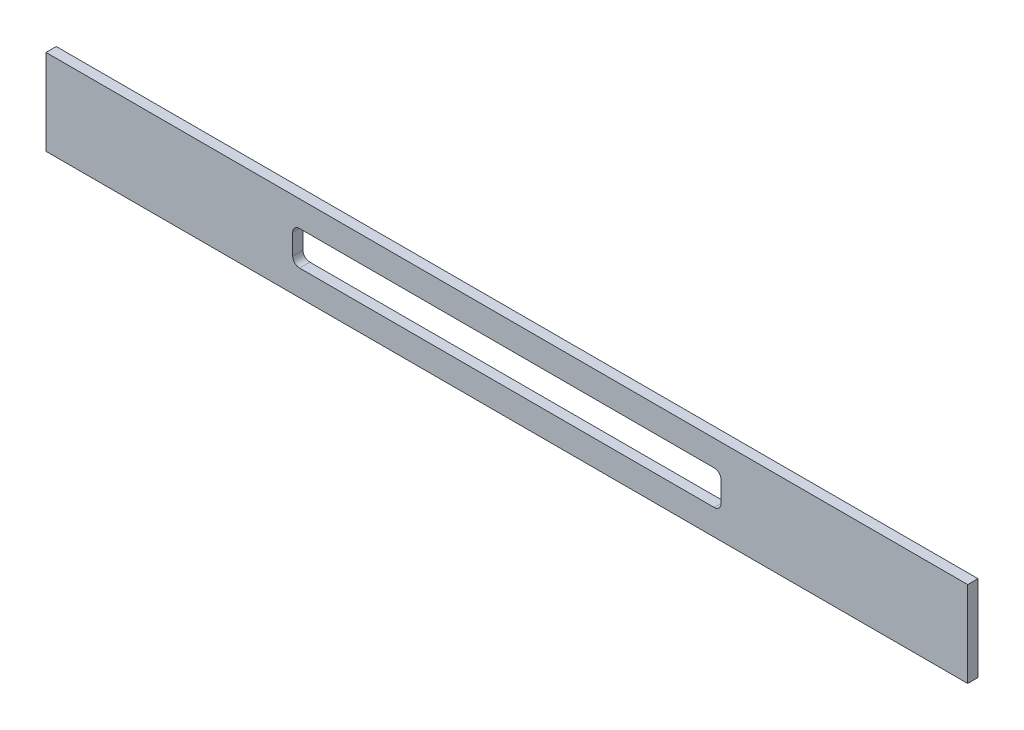
ISO-10303-21;
HEADER;
FILE_DESCRIPTION(('STEP AP214'),'2;1');
FILE_NAME('part.step','',(''),(''),'','','');
FILE_SCHEMA(('AUTOMOTIVE_DESIGN { 1 0 10303 214 1 1 1 1 }'));
ENDSEC;
DATA;
#1=APPLICATION_CONTEXT('core data for automotive mechanical design processes');
#2=APPLICATION_PROTOCOL_DEFINITION('international standard','automotive_design',2000,#1);
#3=PRODUCT_CONTEXT('',#1,'mechanical');
#4=PRODUCT('Part','Part','',(#3));
#5=PRODUCT_RELATED_PRODUCT_CATEGORY('part','',(#4));
#6=PRODUCT_DEFINITION_FORMATION('','',#4);
#7=PRODUCT_DEFINITION_CONTEXT('part definition',#1,'design');
#8=PRODUCT_DEFINITION('design','',#6,#7);
#9=PRODUCT_DEFINITION_SHAPE('','',#8);
#10=(LENGTH_UNIT() NAMED_UNIT(*) SI_UNIT(.MILLI.,.METRE.));
#11=(NAMED_UNIT(*) PLANE_ANGLE_UNIT() SI_UNIT($,.RADIAN.));
#12=(NAMED_UNIT(*) SI_UNIT($,.STERADIAN.) SOLID_ANGLE_UNIT());
#13=UNCERTAINTY_MEASURE_WITH_UNIT(LENGTH_MEASURE(1.E-05),#10,'distance_accuracy_value','');
#14=(GEOMETRIC_REPRESENTATION_CONTEXT(3) GLOBAL_UNCERTAINTY_ASSIGNED_CONTEXT((#13)) GLOBAL_UNIT_ASSIGNED_CONTEXT((#10,
#11,#12)) REPRESENTATION_CONTEXT('',''));
#15=CARTESIAN_POINT('',(0.,0.,0.));
#16=DIRECTION('',(0.,0.,1.));
#17=DIRECTION('',(1.,0.,0.));
#18=AXIS2_PLACEMENT_3D('',#15,#16,#17);
#19=CARTESIAN_POINT('',(0.,0.,6.));
#20=DIRECTION('',(0.,0.,1.));
#21=DIRECTION('',(1.,0.,0.));
#22=AXIS2_PLACEMENT_3D('',#19,#20,#21);
#23=PLANE('',#22);
#24=DIRECTION('',(0.,-1.,0.));
#25=VECTOR('',#24,1.);
#26=CARTESIAN_POINT('',(-173.830324909747,7.20083418302885,6.));
#27=LINE('',#26,#25);
#28=CARTESIAN_POINT('',(-173.830324909747,7.20083418302885,6.));
#29=VERTEX_POINT('',#28);
#30=CARTESIAN_POINT('',(-173.830324909747,-42.7991658169712,6.));
#31=VERTEX_POINT('',#30);
#32=EDGE_CURVE('E218',#29,#31,#27,.T.);
#33=ORIENTED_EDGE('',*,*,#32,.T.);
#34=DIRECTION('',(1.,0.,0.));
#35=VECTOR('',#34,1.);
#36=CARTESIAN_POINT('',(-173.830324909747,-42.7991658169712,6.));
#37=LINE('',#36,#35);
#38=CARTESIAN_POINT('',(364.169675090253,-42.7991658169712,6.));
#39=VERTEX_POINT('',#38);
#40=EDGE_CURVE('E222',#31,#39,#37,.T.);
#41=ORIENTED_EDGE('',*,*,#40,.T.);
#42=DIRECTION('',(0.,1.,0.));
#43=VECTOR('',#42,1.);
#44=CARTESIAN_POINT('',(364.169675090253,7.20083418302885,6.));
#45=LINE('',#44,#43);
#46=CARTESIAN_POINT('',(364.169675090253,7.20083418302885,6.));
#47=VERTEX_POINT('',#46);
#48=EDGE_CURVE('E226',#39,#47,#45,.T.);
#49=ORIENTED_EDGE('',*,*,#48,.T.);
#50=DIRECTION('',(-1.,0.,0.));
#51=VECTOR('',#50,1.);
#52=CARTESIAN_POINT('',(-173.830324909747,7.20083418302885,6.));
#53=LINE('',#52,#51);
#54=EDGE_CURVE('E229',#47,#29,#53,.T.);
#55=ORIENTED_EDGE('',*,*,#54,.T.);
#56=EDGE_LOOP('',(#33,#41,#49,#55));
#57=FACE_BOUND('',#56,.T.);
#58=DIRECTION('',(0.,1.,0.));
#59=VECTOR('',#58,1.);
#60=CARTESIAN_POINT('',(220.169675090253,-11.7991658169712,6.));
#61=LINE('',#60,#59);
#62=CARTESIAN_POINT('',(220.169675090253,-23.7991658169712,6.));
#63=VERTEX_POINT('',#62);
#64=CARTESIAN_POINT('',(220.169675090253,-11.7991658169712,6.));
#65=VERTEX_POINT('',#64);
#66=EDGE_CURVE('E138',#63,#65,#61,.T.);
#67=ORIENTED_EDGE('',*,*,#66,.F.);
#68=CARTESIAN_POINT('',(216.169675090253,-23.7991658169712,6.));
#69=DIRECTION('',(0.,0.,1.));
#70=DIRECTION('',(1.,0.,0.));
#71=AXIS2_PLACEMENT_3D('',#68,#69,#70);
#72=CIRCLE('',#71,4.);
#73=CARTESIAN_POINT('',(216.169675090253,-27.7991658169712,6.));
#74=VERTEX_POINT('',#73);
#75=EDGE_CURVE('E129',#74,#63,#72,.T.);
#76=ORIENTED_EDGE('',*,*,#75,.F.);
#77=DIRECTION('',(1.,0.,0.));
#78=VECTOR('',#77,1.);
#79=CARTESIAN_POINT('',(-25.8303249097473,-27.7991658169712,6.));
#80=LINE('',#79,#78);
#81=CARTESIAN_POINT('',(-25.8303249097473,-27.7991658169712,6.));
#82=VERTEX_POINT('',#81);
#83=EDGE_CURVE('E170',#82,#74,#80,.T.);
#84=ORIENTED_EDGE('',*,*,#83,.F.);
#85=CARTESIAN_POINT('',(-25.8303249097473,-23.7991658169712,6.));
#86=DIRECTION('',(0.,0.,1.));
#87=DIRECTION('',(-1.,0.,0.));
#88=AXIS2_PLACEMENT_3D('',#85,#86,#87);
#89=CIRCLE('',#88,4.);
#90=CARTESIAN_POINT('',(-29.8303249097473,-23.7991658169712,6.));
#91=VERTEX_POINT('',#90);
#92=EDGE_CURVE('E167',#91,#82,#89,.T.);
#93=ORIENTED_EDGE('',*,*,#92,.F.);
#94=DIRECTION('',(0.,-1.,0.));
#95=VECTOR('',#94,1.);
#96=CARTESIAN_POINT('',(-29.8303249097473,-11.7991658169712,6.));
#97=LINE('',#96,#95);
#98=CARTESIAN_POINT('',(-29.8303249097473,-11.7991658169712,6.));
#99=VERTEX_POINT('',#98);
#100=EDGE_CURVE('E164',#99,#91,#97,.T.);
#101=ORIENTED_EDGE('',*,*,#100,.F.);
#102=CARTESIAN_POINT('',(-25.8303249097473,-11.7991658169712,6.));
#103=DIRECTION('',(0.,0.,1.));
#104=DIRECTION('',(1.,0.,0.));
#105=AXIS2_PLACEMENT_3D('',#102,#103,#104);
#106=CIRCLE('',#105,4.);
#107=CARTESIAN_POINT('',(-25.8303249097473,-7.79916581697115,6.));
#108=VERTEX_POINT('',#107);
#109=EDGE_CURVE('E161',#108,#99,#106,.T.);
#110=ORIENTED_EDGE('',*,*,#109,.F.);
#111=DIRECTION('',(-1.,0.,0.));
#112=VECTOR('',#111,1.);
#113=CARTESIAN_POINT('',(-25.8303249097473,-7.79916581697115,6.));
#114=LINE('',#113,#112);
#115=CARTESIAN_POINT('',(216.169675090253,-7.79916581697115,6.));
#116=VERTEX_POINT('',#115);
#117=EDGE_CURVE('E156',#116,#108,#114,.T.);
#118=ORIENTED_EDGE('',*,*,#117,.F.);
#119=CARTESIAN_POINT('',(216.169675090253,-11.7991658169712,6.));
#120=DIRECTION('',(0.,0.,1.));
#121=DIRECTION('',(-1.,0.,0.));
#122=AXIS2_PLACEMENT_3D('',#119,#120,#121);
#123=CIRCLE('',#122,4.);
#124=EDGE_CURVE('E152',#65,#116,#123,.T.);
#125=ORIENTED_EDGE('',*,*,#124,.F.);
#126=EDGE_LOOP('',(#67,#76,#84,#93,#101,#110,#118,#125));
#127=FACE_BOUND('',#126,.T.);
#128=ADVANCED_FACE('F39',(#57,#127),#23,.T.);
#129=CARTESIAN_POINT('',(0.,0.,0.));
#130=DIRECTION('',(0.,0.,1.));
#131=DIRECTION('',(1.,0.,0.));
#132=AXIS2_PLACEMENT_3D('',#129,#130,#131);
#133=PLANE('',#132);
#134=DIRECTION('',(0.,-1.,0.));
#135=VECTOR('',#134,1.);
#136=CARTESIAN_POINT('',(-173.830324909747,7.20083418302885,0.));
#137=LINE('',#136,#135);
#138=CARTESIAN_POINT('',(-173.830324909747,7.20083418302885,0.));
#139=VERTEX_POINT('',#138);
#140=CARTESIAN_POINT('',(-173.830324909747,-42.7991658169712,0.));
#141=VERTEX_POINT('',#140);
#142=EDGE_CURVE('E147',#139,#141,#137,.T.);
#143=ORIENTED_EDGE('',*,*,#142,.F.);
#144=DIRECTION('',(-1.,0.,0.));
#145=VECTOR('',#144,1.);
#146=CARTESIAN_POINT('',(-173.830324909747,7.20083418302885,0.));
#147=LINE('',#146,#145);
#148=CARTESIAN_POINT('',(364.169675090253,7.20083418302885,0.));
#149=VERTEX_POINT('',#148);
#150=EDGE_CURVE('E223',#149,#139,#147,.T.);
#151=ORIENTED_EDGE('',*,*,#150,.F.);
#152=DIRECTION('',(0.,1.,0.));
#153=VECTOR('',#152,1.);
#154=CARTESIAN_POINT('',(364.169675090253,7.20083418302885,0.));
#155=LINE('',#154,#153);
#156=CARTESIAN_POINT('',(364.169675090253,-42.7991658169712,0.));
#157=VERTEX_POINT('',#156);
#158=EDGE_CURVE('E239',#157,#149,#155,.T.);
#159=ORIENTED_EDGE('',*,*,#158,.F.);
#160=DIRECTION('',(1.,0.,0.));
#161=VECTOR('',#160,1.);
#162=CARTESIAN_POINT('',(-173.830324909747,-42.7991658169712,0.));
#163=LINE('',#162,#161);
#164=EDGE_CURVE('E236',#141,#157,#163,.T.);
#165=ORIENTED_EDGE('',*,*,#164,.F.);
#166=EDGE_LOOP('',(#143,#151,#159,#165));
#167=FACE_BOUND('',#166,.T.);
#168=CARTESIAN_POINT('',(216.169675090253,-23.7991658169712,0.));
#169=DIRECTION('',(0.,0.,1.));
#170=DIRECTION('',(1.,0.,0.));
#171=AXIS2_PLACEMENT_3D('',#168,#169,#170);
#172=CIRCLE('',#171,4.);
#173=CARTESIAN_POINT('',(216.169675090253,-27.7991658169712,0.));
#174=VERTEX_POINT('',#173);
#175=CARTESIAN_POINT('',(220.169675090253,-23.7991658169712,0.));
#176=VERTEX_POINT('',#175);
#177=EDGE_CURVE('E63',#174,#176,#172,.T.);
#178=ORIENTED_EDGE('',*,*,#177,.T.);
#179=DIRECTION('',(0.,1.,0.));
#180=VECTOR('',#179,1.);
#181=CARTESIAN_POINT('',(220.169675090253,-11.7991658169712,0.));
#182=LINE('',#181,#180);
#183=CARTESIAN_POINT('',(220.169675090253,-11.7991658169712,0.));
#184=VERTEX_POINT('',#183);
#185=EDGE_CURVE('E145',#176,#184,#182,.T.);
#186=ORIENTED_EDGE('',*,*,#185,.T.);
#187=CARTESIAN_POINT('',(216.169675090253,-11.7991658169712,0.));
#188=DIRECTION('',(0.,0.,1.));
#189=DIRECTION('',(-1.,0.,0.));
#190=AXIS2_PLACEMENT_3D('',#187,#188,#189);
#191=CIRCLE('',#190,4.);
#192=CARTESIAN_POINT('',(216.169675090253,-7.79916581697115,0.));
#193=VERTEX_POINT('',#192);
#194=EDGE_CURVE('E177',#184,#193,#191,.T.);
#195=ORIENTED_EDGE('',*,*,#194,.T.);
#196=DIRECTION('',(-1.,0.,0.));
#197=VECTOR('',#196,1.);
#198=CARTESIAN_POINT('',(-25.8303249097473,-7.79916581697115,0.));
#199=LINE('',#198,#197);
#200=CARTESIAN_POINT('',(-25.8303249097473,-7.79916581697115,0.));
#201=VERTEX_POINT('',#200);
#202=EDGE_CURVE('E181',#193,#201,#199,.T.);
#203=ORIENTED_EDGE('',*,*,#202,.T.);
#204=CARTESIAN_POINT('',(-25.8303249097473,-11.7991658169712,0.));
#205=DIRECTION('',(0.,0.,1.));
#206=DIRECTION('',(1.,0.,0.));
#207=AXIS2_PLACEMENT_3D('',#204,#205,#206);
#208=CIRCLE('',#207,4.);
#209=CARTESIAN_POINT('',(-29.8303249097473,-11.7991658169712,0.));
#210=VERTEX_POINT('',#209);
#211=EDGE_CURVE('E185',#201,#210,#208,.T.);
#212=ORIENTED_EDGE('',*,*,#211,.T.);
#213=DIRECTION('',(0.,-1.,0.));
#214=VECTOR('',#213,1.);
#215=CARTESIAN_POINT('',(-29.8303249097473,-11.7991658169712,0.));
#216=LINE('',#215,#214);
#217=CARTESIAN_POINT('',(-29.8303249097473,-23.7991658169712,0.));
#218=VERTEX_POINT('',#217);
#219=EDGE_CURVE('E189',#210,#218,#216,.T.);
#220=ORIENTED_EDGE('',*,*,#219,.T.);
#221=CARTESIAN_POINT('',(-25.8303249097473,-23.7991658169712,0.));
#222=DIRECTION('',(0.,0.,1.));
#223=DIRECTION('',(-1.,0.,0.));
#224=AXIS2_PLACEMENT_3D('',#221,#222,#223);
#225=CIRCLE('',#224,4.);
#226=CARTESIAN_POINT('',(-25.8303249097473,-27.7991658169712,0.));
#227=VERTEX_POINT('',#226);
#228=EDGE_CURVE('E193',#218,#227,#225,.T.);
#229=ORIENTED_EDGE('',*,*,#228,.T.);
#230=DIRECTION('',(1.,0.,0.));
#231=VECTOR('',#230,1.);
#232=CARTESIAN_POINT('',(-25.8303249097473,-27.7991658169712,0.));
#233=LINE('',#232,#231);
#234=EDGE_CURVE('E139',#227,#174,#233,.T.);
#235=ORIENTED_EDGE('',*,*,#234,.T.);
#236=EDGE_LOOP('',(#178,#186,#195,#203,#212,#220,#229,#235));
#237=FACE_BOUND('',#236,.T.);
#238=ADVANCED_FACE('F262',(#167,#237),#133,.F.);
#239=CARTESIAN_POINT('',(-173.830324909747,7.20083418302885,6.));
#240=DIRECTION('',(1.,0.,0.));
#241=DIRECTION('',(0.,0.,-1.));
#242=AXIS2_PLACEMENT_3D('',#239,#240,#241);
#243=PLANE('',#242);
#244=ORIENTED_EDGE('',*,*,#142,.T.);
#245=DIRECTION('',(0.,0.,-1.));
#246=VECTOR('',#245,1.);
#247=CARTESIAN_POINT('',(-173.830324909747,-42.7991658169712,6.));
#248=LINE('',#247,#246);
#249=EDGE_CURVE('E11',#31,#141,#248,.T.);
#250=ORIENTED_EDGE('',*,*,#249,.F.);
#251=ORIENTED_EDGE('',*,*,#32,.F.);
#252=DIRECTION('',(0.,0.,-1.));
#253=VECTOR('',#252,1.);
#254=CARTESIAN_POINT('',(-173.830324909747,7.20083418302885,6.));
#255=LINE('',#254,#253);
#256=EDGE_CURVE('E232',#29,#139,#255,.T.);
#257=ORIENTED_EDGE('',*,*,#256,.T.);
#258=EDGE_LOOP('',(#244,#250,#251,#257));
#259=FACE_BOUND('',#258,.T.);
#260=ADVANCED_FACE('F41',(#259),#243,.F.);
#261=CARTESIAN_POINT('',(-173.830324909747,-42.7991658169712,6.));
#262=DIRECTION('',(0.,1.,0.));
#263=DIRECTION('',(0.,0.,1.));
#264=AXIS2_PLACEMENT_3D('',#261,#262,#263);
#265=PLANE('',#264);
#266=ORIENTED_EDGE('',*,*,#164,.T.);
#267=DIRECTION('',(0.,0.,-1.));
#268=VECTOR('',#267,1.);
#269=CARTESIAN_POINT('',(364.169675090253,-42.7991658169712,6.));
#270=LINE('',#269,#268);
#271=EDGE_CURVE('E48',#39,#157,#270,.T.);
#272=ORIENTED_EDGE('',*,*,#271,.F.);
#273=ORIENTED_EDGE('',*,*,#40,.F.);
#274=ORIENTED_EDGE('',*,*,#249,.T.);
#275=EDGE_LOOP('',(#266,#272,#273,#274));
#276=FACE_BOUND('',#275,.T.);
#277=ADVANCED_FACE('F272',(#276),#265,.F.);
#278=CARTESIAN_POINT('',(364.169675090253,7.20083418302885,6.));
#279=DIRECTION('',(-1.,0.,0.));
#280=DIRECTION('',(0.,0.,1.));
#281=AXIS2_PLACEMENT_3D('',#278,#279,#280);
#282=PLANE('',#281);
#283=ORIENTED_EDGE('',*,*,#158,.T.);
#284=DIRECTION('',(0.,0.,-1.));
#285=VECTOR('',#284,1.);
#286=CARTESIAN_POINT('',(364.169675090253,7.20083418302885,6.));
#287=LINE('',#286,#285);
#288=EDGE_CURVE('E247',#47,#149,#287,.T.);
#289=ORIENTED_EDGE('',*,*,#288,.F.);
#290=ORIENTED_EDGE('',*,*,#48,.F.);
#291=ORIENTED_EDGE('',*,*,#271,.T.);
#292=EDGE_LOOP('',(#283,#289,#290,#291));
#293=FACE_BOUND('',#292,.T.);
#294=ADVANCED_FACE('F256',(#293),#282,.F.);
#295=CARTESIAN_POINT('',(-173.830324909747,7.20083418302885,6.));
#296=DIRECTION('',(0.,-1.,0.));
#297=DIRECTION('',(0.,0.,-1.));
#298=AXIS2_PLACEMENT_3D('',#295,#296,#297);
#299=PLANE('',#298);
#300=ORIENTED_EDGE('',*,*,#150,.T.);
#301=ORIENTED_EDGE('',*,*,#256,.F.);
#302=ORIENTED_EDGE('',*,*,#54,.F.);
#303=ORIENTED_EDGE('',*,*,#288,.T.);
#304=EDGE_LOOP('',(#300,#301,#302,#303));
#305=FACE_BOUND('',#304,.T.);
#306=ADVANCED_FACE('F266',(#305),#299,.F.);
#307=CARTESIAN_POINT('',(216.169675090253,-23.7991658169712,6.));
#308=DIRECTION('',(0.,0.,-1.));
#309=DIRECTION('',(-1.,0.,0.));
#310=AXIS2_PLACEMENT_3D('',#307,#308,#309);
#311=CYLINDRICAL_SURFACE('',#310,4.);
#312=ORIENTED_EDGE('',*,*,#177,.F.);
#313=DIRECTION('',(0.,0.,-1.));
#314=VECTOR('',#313,1.);
#315=CARTESIAN_POINT('',(216.169675090253,-27.7991658169712,6.));
#316=LINE('',#315,#314);
#317=EDGE_CURVE('E133',#74,#174,#316,.T.);
#318=ORIENTED_EDGE('',*,*,#317,.F.);
#319=ORIENTED_EDGE('',*,*,#75,.T.);
#320=DIRECTION('',(0.,0.,-1.));
#321=VECTOR('',#320,1.);
#322=CARTESIAN_POINT('',(220.169675090253,-23.7991658169712,6.));
#323=LINE('',#322,#321);
#324=EDGE_CURVE('E132',#63,#176,#323,.T.);
#325=ORIENTED_EDGE('',*,*,#324,.T.);
#326=EDGE_LOOP('',(#312,#318,#319,#325));
#327=FACE_BOUND('',#326,.T.);
#328=ADVANCED_FACE('F131',(#327),#311,.F.);
#329=CARTESIAN_POINT('',(220.169675090253,-11.7991658169712,6.));
#330=DIRECTION('',(-1.,0.,0.));
#331=DIRECTION('',(0.,0.,1.));
#332=AXIS2_PLACEMENT_3D('',#329,#330,#331);
#333=PLANE('',#332);
#334=ORIENTED_EDGE('',*,*,#185,.F.);
#335=ORIENTED_EDGE('',*,*,#324,.F.);
#336=ORIENTED_EDGE('',*,*,#66,.T.);
#337=DIRECTION('',(0.,0.,-1.));
#338=VECTOR('',#337,1.);
#339=CARTESIAN_POINT('',(220.169675090253,-11.7991658169712,6.));
#340=LINE('',#339,#338);
#341=EDGE_CURVE('E148',#65,#184,#340,.T.);
#342=ORIENTED_EDGE('',*,*,#341,.T.);
#343=EDGE_LOOP('',(#334,#335,#336,#342));
#344=FACE_BOUND('',#343,.T.);
#345=ADVANCED_FACE('F142',(#344),#333,.T.);
#346=CARTESIAN_POINT('',(216.169675090253,-11.7991658169712,6.));
#347=DIRECTION('',(0.,0.,-1.));
#348=DIRECTION('',(-1.,0.,0.));
#349=AXIS2_PLACEMENT_3D('',#346,#347,#348);
#350=CYLINDRICAL_SURFACE('',#349,4.);
#351=ORIENTED_EDGE('',*,*,#194,.F.);
#352=ORIENTED_EDGE('',*,*,#341,.F.);
#353=ORIENTED_EDGE('',*,*,#124,.T.);
#354=DIRECTION('',(0.,0.,-1.));
#355=VECTOR('',#354,1.);
#356=CARTESIAN_POINT('',(216.169675090253,-7.79916581697115,6.));
#357=LINE('',#356,#355);
#358=EDGE_CURVE('E213',#116,#193,#357,.T.);
#359=ORIENTED_EDGE('',*,*,#358,.T.);
#360=EDGE_LOOP('',(#351,#352,#353,#359));
#361=FACE_BOUND('',#360,.T.);
#362=ADVANCED_FACE('F295',(#361),#350,.F.);
#363=CARTESIAN_POINT('',(-25.8303249097473,-7.79916581697115,6.));
#364=DIRECTION('',(0.,-1.,0.));
#365=DIRECTION('',(0.,0.,-1.));
#366=AXIS2_PLACEMENT_3D('',#363,#364,#365);
#367=PLANE('',#366);
#368=ORIENTED_EDGE('',*,*,#202,.F.);
#369=ORIENTED_EDGE('',*,*,#358,.F.);
#370=ORIENTED_EDGE('',*,*,#117,.T.);
#371=DIRECTION('',(0.,0.,-1.));
#372=VECTOR('',#371,1.);
#373=CARTESIAN_POINT('',(-25.8303249097473,-7.79916581697115,6.));
#374=LINE('',#373,#372);
#375=EDGE_CURVE('E210',#108,#201,#374,.T.);
#376=ORIENTED_EDGE('',*,*,#375,.T.);
#377=EDGE_LOOP('',(#368,#369,#370,#376));
#378=FACE_BOUND('',#377,.T.);
#379=ADVANCED_FACE('F299',(#378),#367,.T.);
#380=CARTESIAN_POINT('',(-25.8303249097473,-11.7991658169712,6.));
#381=DIRECTION('',(0.,0.,-1.));
#382=DIRECTION('',(-1.,0.,0.));
#383=AXIS2_PLACEMENT_3D('',#380,#381,#382);
#384=CYLINDRICAL_SURFACE('',#383,4.);
#385=ORIENTED_EDGE('',*,*,#211,.F.);
#386=ORIENTED_EDGE('',*,*,#375,.F.);
#387=ORIENTED_EDGE('',*,*,#109,.T.);
#388=DIRECTION('',(0.,0.,-1.));
#389=VECTOR('',#388,1.);
#390=CARTESIAN_POINT('',(-29.8303249097473,-11.7991658169712,6.));
#391=LINE('',#390,#389);
#392=EDGE_CURVE('E207',#99,#210,#391,.T.);
#393=ORIENTED_EDGE('',*,*,#392,.T.);
#394=EDGE_LOOP('',(#385,#386,#387,#393));
#395=FACE_BOUND('',#394,.T.);
#396=ADVANCED_FACE('F305',(#395),#384,.F.);
#397=CARTESIAN_POINT('',(-29.8303249097473,-11.7991658169712,6.));
#398=DIRECTION('',(1.,0.,0.));
#399=DIRECTION('',(0.,0.,-1.));
#400=AXIS2_PLACEMENT_3D('',#397,#398,#399);
#401=PLANE('',#400);
#402=ORIENTED_EDGE('',*,*,#219,.F.);
#403=ORIENTED_EDGE('',*,*,#392,.F.);
#404=ORIENTED_EDGE('',*,*,#100,.T.);
#405=DIRECTION('',(0.,0.,-1.));
#406=VECTOR('',#405,1.);
#407=CARTESIAN_POINT('',(-29.8303249097473,-23.7991658169712,6.));
#408=LINE('',#407,#406);
#409=EDGE_CURVE('E204',#91,#218,#408,.T.);
#410=ORIENTED_EDGE('',*,*,#409,.T.);
#411=EDGE_LOOP('',(#402,#403,#404,#410));
#412=FACE_BOUND('',#411,.T.);
#413=ADVANCED_FACE('F309',(#412),#401,.T.);
#414=CARTESIAN_POINT('',(-25.8303249097473,-23.7991658169712,6.));
#415=DIRECTION('',(0.,0.,-1.));
#416=DIRECTION('',(-1.,0.,0.));
#417=AXIS2_PLACEMENT_3D('',#414,#415,#416);
#418=CYLINDRICAL_SURFACE('',#417,4.);
#419=ORIENTED_EDGE('',*,*,#228,.F.);
#420=ORIENTED_EDGE('',*,*,#409,.F.);
#421=ORIENTED_EDGE('',*,*,#92,.T.);
#422=DIRECTION('',(0.,0.,-1.));
#423=VECTOR('',#422,1.);
#424=CARTESIAN_POINT('',(-25.8303249097473,-27.7991658169712,6.));
#425=LINE('',#424,#423);
#426=EDGE_CURVE('E55',#82,#227,#425,.T.);
#427=ORIENTED_EDGE('',*,*,#426,.T.);
#428=EDGE_LOOP('',(#419,#420,#421,#427));
#429=FACE_BOUND('',#428,.T.);
#430=ADVANCED_FACE('F313',(#429),#418,.F.);
#431=CARTESIAN_POINT('',(-25.8303249097473,-27.7991658169712,6.));
#432=DIRECTION('',(0.,1.,0.));
#433=DIRECTION('',(0.,0.,1.));
#434=AXIS2_PLACEMENT_3D('',#431,#432,#433);
#435=PLANE('',#434);
#436=ORIENTED_EDGE('',*,*,#234,.F.);
#437=ORIENTED_EDGE('',*,*,#426,.F.);
#438=ORIENTED_EDGE('',*,*,#83,.T.);
#439=ORIENTED_EDGE('',*,*,#317,.T.);
#440=EDGE_LOOP('',(#436,#437,#438,#439));
#441=FACE_BOUND('',#440,.T.);
#442=ADVANCED_FACE('F317',(#441),#435,.T.);
#443=CLOSED_SHELL('',(#128,#238,#260,#277,#294,#306,#328,#345,#362,#379,#396,#413,#430,#442));
#444=MANIFOLD_SOLID_BREP('B2',#443);
#445=ADVANCED_BREP_SHAPE_REPRESENTATION('',(#18,#444),#14);
#446=SHAPE_DEFINITION_REPRESENTATION(#9,#445);
ENDSEC;
END-ISO-10303-21;
